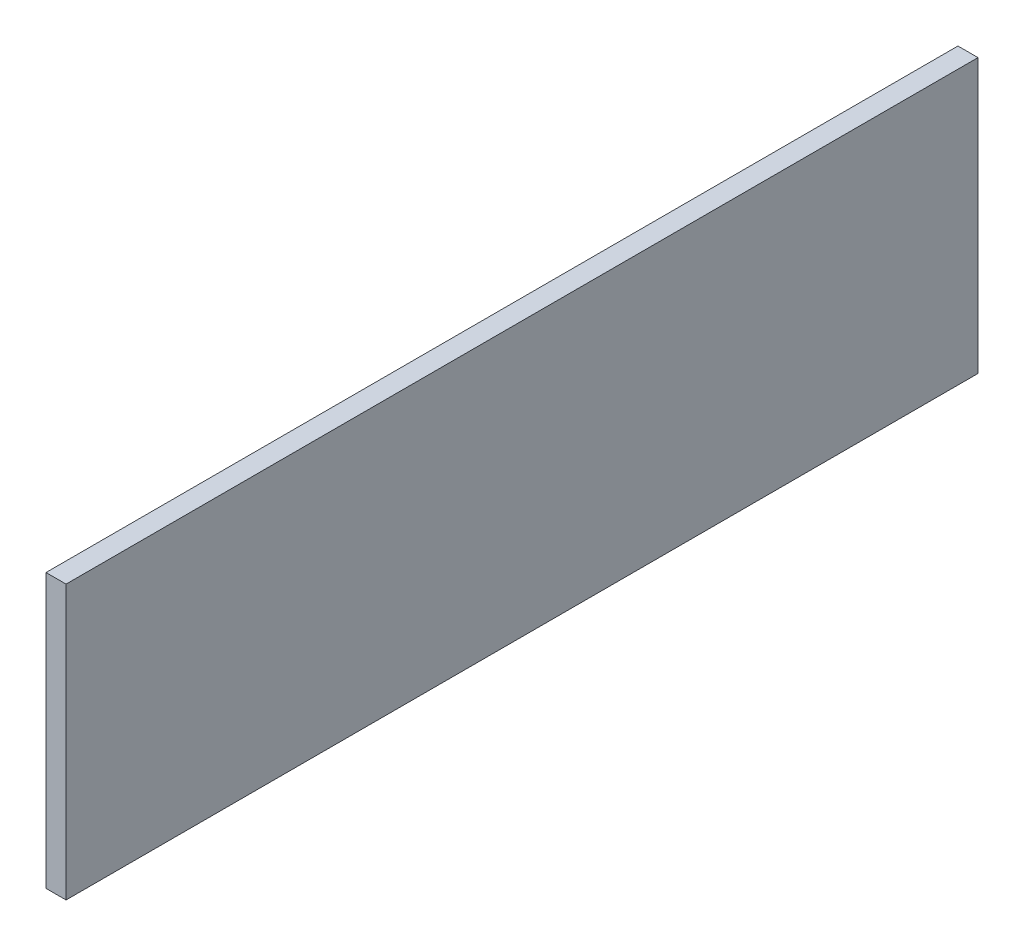
ISO-10303-21;
HEADER;
FILE_DESCRIPTION(('STEP AP214'),'2;1');
FILE_NAME('part.step','',(''),(''),'','','');
FILE_SCHEMA(('AUTOMOTIVE_DESIGN { 1 0 10303 214 1 1 1 1 }'));
ENDSEC;
DATA;
#1=APPLICATION_CONTEXT('core data for automotive mechanical design processes');
#2=APPLICATION_PROTOCOL_DEFINITION('international standard','automotive_design',2000,#1);
#3=PRODUCT_CONTEXT('',#1,'mechanical');
#4=PRODUCT('Part','Part','',(#3));
#5=PRODUCT_RELATED_PRODUCT_CATEGORY('part','',(#4));
#6=PRODUCT_DEFINITION_FORMATION('','',#4);
#7=PRODUCT_DEFINITION_CONTEXT('part definition',#1,'design');
#8=PRODUCT_DEFINITION('design','',#6,#7);
#9=PRODUCT_DEFINITION_SHAPE('','',#8);
#10=(LENGTH_UNIT() NAMED_UNIT(*) SI_UNIT(.MILLI.,.METRE.));
#11=(NAMED_UNIT(*) PLANE_ANGLE_UNIT() SI_UNIT($,.RADIAN.));
#12=(NAMED_UNIT(*) SI_UNIT($,.STERADIAN.) SOLID_ANGLE_UNIT());
#13=UNCERTAINTY_MEASURE_WITH_UNIT(LENGTH_MEASURE(1.E-05),#10,'distance_accuracy_value','');
#14=(GEOMETRIC_REPRESENTATION_CONTEXT(3) GLOBAL_UNCERTAINTY_ASSIGNED_CONTEXT((#13)) GLOBAL_UNIT_ASSIGNED_CONTEXT((#10,
#11,#12)) REPRESENTATION_CONTEXT('',''));
#15=CARTESIAN_POINT('',(0.,0.,0.));
#16=DIRECTION('',(0.,0.,1.));
#17=DIRECTION('',(1.,0.,0.));
#18=AXIS2_PLACEMENT_3D('',#15,#16,#17);
#19=CARTESIAN_POINT('',(5.588,-38.1,-127.));
#20=DIRECTION('',(0.,0.,1.));
#21=DIRECTION('',(1.,0.,0.));
#22=AXIS2_PLACEMENT_3D('',#19,#20,#21);
#23=PLANE('',#22);
#24=DIRECTION('',(0.,1.,0.));
#25=VECTOR('',#24,1.);
#26=CARTESIAN_POINT('',(0.,-38.1,-127.));
#27=LINE('',#26,#25);
#28=CARTESIAN_POINT('',(0.,-38.1,-127.));
#29=VERTEX_POINT('',#28);
#30=CARTESIAN_POINT('',(0.,38.1,-127.));
#31=VERTEX_POINT('',#30);
#32=EDGE_CURVE('E100',#29,#31,#27,.T.);
#33=ORIENTED_EDGE('',*,*,#32,.T.);
#34=DIRECTION('',(-1.,0.,0.));
#35=VECTOR('',#34,1.);
#36=CARTESIAN_POINT('',(5.588,38.1,-127.));
#37=LINE('',#36,#35);
#38=CARTESIAN_POINT('',(5.588,38.1,-127.));
#39=VERTEX_POINT('',#38);
#40=EDGE_CURVE('E11',#39,#31,#37,.T.);
#41=ORIENTED_EDGE('',*,*,#40,.F.);
#42=DIRECTION('',(0.,1.,0.));
#43=VECTOR('',#42,1.);
#44=CARTESIAN_POINT('',(5.588,-38.1,-127.));
#45=LINE('',#44,#43);
#46=CARTESIAN_POINT('',(5.588,-38.1,-127.));
#47=VERTEX_POINT('',#46);
#48=EDGE_CURVE('E88',#47,#39,#45,.T.);
#49=ORIENTED_EDGE('',*,*,#48,.F.);
#50=DIRECTION('',(-1.,0.,0.));
#51=VECTOR('',#50,1.);
#52=CARTESIAN_POINT('',(5.588,-38.1,-127.));
#53=LINE('',#52,#51);
#54=EDGE_CURVE('E96',#47,#29,#53,.T.);
#55=ORIENTED_EDGE('',*,*,#54,.T.);
#56=EDGE_LOOP('',(#33,#41,#49,#55));
#57=FACE_BOUND('',#56,.T.);
#58=ADVANCED_FACE('F37',(#57),#23,.F.);
#59=CARTESIAN_POINT('',(5.588,38.1,127.));
#60=DIRECTION('',(0.,-1.,0.));
#61=DIRECTION('',(0.,0.,-1.));
#62=AXIS2_PLACEMENT_3D('',#59,#60,#61);
#63=PLANE('',#62);
#64=DIRECTION('',(0.,0.,1.));
#65=VECTOR('',#64,1.);
#66=CARTESIAN_POINT('',(0.,38.1,127.));
#67=LINE('',#66,#65);
#68=CARTESIAN_POINT('',(0.,38.1,127.));
#69=VERTEX_POINT('',#68);
#70=EDGE_CURVE('E92',#31,#69,#67,.T.);
#71=ORIENTED_EDGE('',*,*,#70,.T.);
#72=DIRECTION('',(-1.,0.,0.));
#73=VECTOR('',#72,1.);
#74=CARTESIAN_POINT('',(5.588,38.1,127.));
#75=LINE('',#74,#73);
#76=CARTESIAN_POINT('',(5.588,38.1,127.));
#77=VERTEX_POINT('',#76);
#78=EDGE_CURVE('E45',#77,#69,#75,.T.);
#79=ORIENTED_EDGE('',*,*,#78,.F.);
#80=DIRECTION('',(0.,0.,1.));
#81=VECTOR('',#80,1.);
#82=CARTESIAN_POINT('',(5.588,38.1,127.));
#83=LINE('',#82,#81);
#84=EDGE_CURVE('E83',#39,#77,#83,.T.);
#85=ORIENTED_EDGE('',*,*,#84,.F.);
#86=ORIENTED_EDGE('',*,*,#40,.T.);
#87=EDGE_LOOP('',(#71,#79,#85,#86));
#88=FACE_BOUND('',#87,.T.);
#89=ADVANCED_FACE('F91',(#88),#63,.F.);
#90=CARTESIAN_POINT('',(5.588,-38.1,127.));
#91=DIRECTION('',(0.,0.,-1.));
#92=DIRECTION('',(-1.,0.,0.));
#93=AXIS2_PLACEMENT_3D('',#90,#91,#92);
#94=PLANE('',#93);
#95=DIRECTION('',(0.,-1.,0.));
#96=VECTOR('',#95,1.);
#97=CARTESIAN_POINT('',(0.,-38.1,127.));
#98=LINE('',#97,#96);
#99=CARTESIAN_POINT('',(0.,-38.1,127.));
#100=VERTEX_POINT('',#99);
#101=EDGE_CURVE('E70',#69,#100,#98,.T.);
#102=ORIENTED_EDGE('',*,*,#101,.T.);
#103=DIRECTION('',(-1.,0.,0.));
#104=VECTOR('',#103,1.);
#105=CARTESIAN_POINT('',(5.588,-38.1,127.));
#106=LINE('',#105,#104);
#107=CARTESIAN_POINT('',(5.588,-38.1,127.));
#108=VERTEX_POINT('',#107);
#109=EDGE_CURVE('E93',#108,#100,#106,.T.);
#110=ORIENTED_EDGE('',*,*,#109,.F.);
#111=DIRECTION('',(0.,-1.,0.));
#112=VECTOR('',#111,1.);
#113=CARTESIAN_POINT('',(5.588,-38.1,127.));
#114=LINE('',#113,#112);
#115=EDGE_CURVE('E86',#77,#108,#114,.T.);
#116=ORIENTED_EDGE('',*,*,#115,.F.);
#117=ORIENTED_EDGE('',*,*,#78,.T.);
#118=EDGE_LOOP('',(#102,#110,#116,#117));
#119=FACE_BOUND('',#118,.T.);
#120=ADVANCED_FACE('F94',(#119),#94,.F.);
#121=CARTESIAN_POINT('',(5.588,-38.1,127.));
#122=DIRECTION('',(0.,1.,0.));
#123=DIRECTION('',(0.,0.,1.));
#124=AXIS2_PLACEMENT_3D('',#121,#122,#123);
#125=PLANE('',#124);
#126=DIRECTION('',(0.,0.,-1.));
#127=VECTOR('',#126,1.);
#128=CARTESIAN_POINT('',(0.,-38.1,127.));
#129=LINE('',#128,#127);
#130=EDGE_CURVE('E76',#100,#29,#129,.T.);
#131=ORIENTED_EDGE('',*,*,#130,.T.);
#132=ORIENTED_EDGE('',*,*,#54,.F.);
#133=DIRECTION('',(0.,0.,-1.));
#134=VECTOR('',#133,1.);
#135=CARTESIAN_POINT('',(5.588,-38.1,127.));
#136=LINE('',#135,#134);
#137=EDGE_CURVE('E53',#108,#47,#136,.T.);
#138=ORIENTED_EDGE('',*,*,#137,.F.);
#139=ORIENTED_EDGE('',*,*,#109,.T.);
#140=EDGE_LOOP('',(#131,#132,#138,#139));
#141=FACE_BOUND('',#140,.T.);
#142=ADVANCED_FACE('F107',(#141),#125,.F.);
#143=CARTESIAN_POINT('',(5.588,0.,0.));
#144=DIRECTION('',(-1.,0.,0.));
#145=DIRECTION('',(0.,0.,1.));
#146=AXIS2_PLACEMENT_3D('',#143,#144,#145);
#147=PLANE('',#146);
#148=ORIENTED_EDGE('',*,*,#48,.T.);
#149=ORIENTED_EDGE('',*,*,#84,.T.);
#150=ORIENTED_EDGE('',*,*,#115,.T.);
#151=ORIENTED_EDGE('',*,*,#137,.T.);
#152=EDGE_LOOP('',(#148,#149,#150,#151));
#153=FACE_BOUND('',#152,.T.);
#154=ADVANCED_FACE('F84',(#153),#147,.F.);
#155=CARTESIAN_POINT('',(0.,0.,0.));
#156=DIRECTION('',(-1.,0.,0.));
#157=DIRECTION('',(0.,0.,1.));
#158=AXIS2_PLACEMENT_3D('',#155,#156,#157);
#159=PLANE('',#158);
#160=ORIENTED_EDGE('',*,*,#32,.F.);
#161=ORIENTED_EDGE('',*,*,#130,.F.);
#162=ORIENTED_EDGE('',*,*,#101,.F.);
#163=ORIENTED_EDGE('',*,*,#70,.F.);
#164=EDGE_LOOP('',(#160,#161,#162,#163));
#165=FACE_BOUND('',#164,.T.);
#166=ADVANCED_FACE('F110',(#165),#159,.T.);
#167=CLOSED_SHELL('',(#58,#89,#120,#142,#154,#166));
#168=MANIFOLD_SOLID_BREP('B2',#167);
#169=ADVANCED_BREP_SHAPE_REPRESENTATION('',(#18,#168),#14);
#170=SHAPE_DEFINITION_REPRESENTATION(#9,#169);
ENDSEC;
END-ISO-10303-21;
